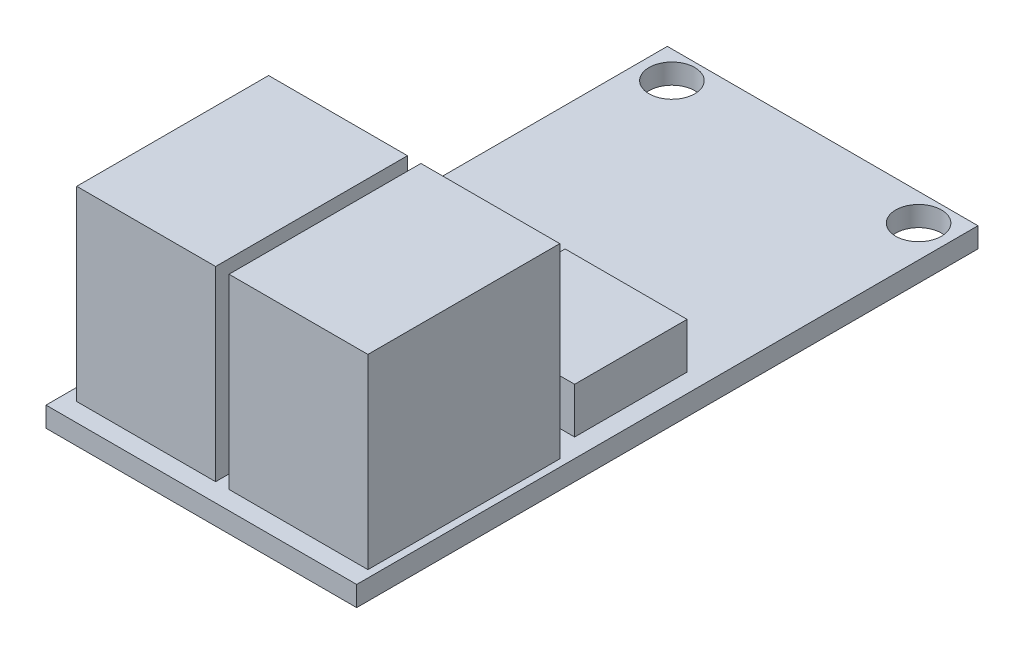
ISO-10303-21;
HEADER;
FILE_DESCRIPTION(('STEP AP214'),'2;1');
FILE_NAME('part.step','',(''),(''),'','','');
FILE_SCHEMA(('AUTOMOTIVE_DESIGN { 1 0 10303 214 1 1 1 1 }'));
ENDSEC;
DATA;
#1=APPLICATION_CONTEXT('core data for automotive mechanical design processes');
#2=APPLICATION_PROTOCOL_DEFINITION('international standard','automotive_design',2000,#1);
#3=PRODUCT_CONTEXT('',#1,'mechanical');
#4=PRODUCT('Part','Part','',(#3));
#5=PRODUCT_RELATED_PRODUCT_CATEGORY('part','',(#4));
#6=PRODUCT_DEFINITION_FORMATION('','',#4);
#7=PRODUCT_DEFINITION_CONTEXT('part definition',#1,'design');
#8=PRODUCT_DEFINITION('design','',#6,#7);
#9=PRODUCT_DEFINITION_SHAPE('','',#8);
#10=(LENGTH_UNIT() NAMED_UNIT(*) SI_UNIT(.MILLI.,.METRE.));
#11=(NAMED_UNIT(*) PLANE_ANGLE_UNIT() SI_UNIT($,.RADIAN.));
#12=(NAMED_UNIT(*) SI_UNIT($,.STERADIAN.) SOLID_ANGLE_UNIT());
#13=UNCERTAINTY_MEASURE_WITH_UNIT(LENGTH_MEASURE(1.E-05),#10,'distance_accuracy_value','');
#14=(GEOMETRIC_REPRESENTATION_CONTEXT(3) GLOBAL_UNCERTAINTY_ASSIGNED_CONTEXT((#13)) GLOBAL_UNIT_ASSIGNED_CONTEXT((#10,
#11,#12)) REPRESENTATION_CONTEXT('',''));
#15=CARTESIAN_POINT('',(0.,0.,0.));
#16=DIRECTION('',(0.,0.,1.));
#17=DIRECTION('',(1.,0.,0.));
#18=AXIS2_PLACEMENT_3D('',#15,#16,#17);
#19=CARTESIAN_POINT('',(9.30380204289463,3.6,-19.1029979436487));
#20=DIRECTION('',(1.,0.,0.));
#21=DIRECTION('',(0.,0.,-1.));
#22=AXIS2_PLACEMENT_3D('',#19,#20,#21);
#23=PLANE('',#22);
#24=DIRECTION('',(0.,0.,1.));
#25=VECTOR('',#24,1.);
#26=CARTESIAN_POINT('',(9.30380204289463,1.1,-19.1029979436487));
#27=LINE('',#26,#25);
#28=CARTESIAN_POINT('',(9.30380204289463,1.1,-19.1029979436487));
#29=VERTEX_POINT('',#28);
#30=CARTESIAN_POINT('',(9.30380204289463,1.1,-12.9497817381579));
#31=VERTEX_POINT('',#30);
#32=EDGE_CURVE('E12',#29,#31,#27,.T.);
#33=ORIENTED_EDGE('',*,*,#32,.T.);
#34=DIRECTION('',(0.,-1.,0.));
#35=VECTOR('',#34,1.);
#36=CARTESIAN_POINT('',(9.30380204289463,3.6,-12.9497817381579));
#37=LINE('',#36,#35);
#38=CARTESIAN_POINT('',(9.30380204289463,3.6,-12.9497817381579));
#39=VERTEX_POINT('',#38);
#40=EDGE_CURVE('E127',#39,#31,#37,.T.);
#41=ORIENTED_EDGE('',*,*,#40,.F.);
#42=DIRECTION('',(0.,0.,1.));
#43=VECTOR('',#42,1.);
#44=CARTESIAN_POINT('',(9.30380204289463,3.6,-19.1029979436487));
#45=LINE('',#44,#43);
#46=CARTESIAN_POINT('',(9.30380204289463,3.6,-19.1029979436487));
#47=VERTEX_POINT('',#46);
#48=EDGE_CURVE('E60',#47,#39,#45,.T.);
#49=ORIENTED_EDGE('',*,*,#48,.F.);
#50=DIRECTION('',(0.,-1.,0.));
#51=VECTOR('',#50,1.);
#52=CARTESIAN_POINT('',(9.30380204289463,3.6,-19.1029979436487));
#53=LINE('',#52,#51);
#54=EDGE_CURVE('E115',#47,#29,#53,.T.);
#55=ORIENTED_EDGE('',*,*,#54,.T.);
#56=EDGE_LOOP('',(#33,#41,#49,#55));
#57=FACE_BOUND('',#56,.T.);
#58=ADVANCED_FACE('F56',(#57),#23,.F.);
#59=CARTESIAN_POINT('',(9.30380204289463,3.6,-12.9497817381579));
#60=DIRECTION('',(0.,0.,-1.));
#61=DIRECTION('',(-1.,0.,0.));
#62=AXIS2_PLACEMENT_3D('',#59,#60,#61);
#63=PLANE('',#62);
#64=DIRECTION('',(1.,0.,0.));
#65=VECTOR('',#64,1.);
#66=CARTESIAN_POINT('',(9.30380204289463,1.1,-12.9497817381579));
#67=LINE('',#66,#65);
#68=CARTESIAN_POINT('',(15.9773260218623,1.1,-12.9497817381579));
#69=VERTEX_POINT('',#68);
#70=EDGE_CURVE('E66',#31,#69,#67,.T.);
#71=ORIENTED_EDGE('',*,*,#70,.T.);
#72=DIRECTION('',(0.,-1.,0.));
#73=VECTOR('',#72,1.);
#74=CARTESIAN_POINT('',(15.9773260218623,3.6,-12.9497817381579));
#75=LINE('',#74,#73);
#76=CARTESIAN_POINT('',(15.9773260218623,3.6,-12.9497817381579));
#77=VERTEX_POINT('',#76);
#78=EDGE_CURVE('E111',#77,#69,#75,.T.);
#79=ORIENTED_EDGE('',*,*,#78,.F.);
#80=DIRECTION('',(1.,0.,0.));
#81=VECTOR('',#80,1.);
#82=CARTESIAN_POINT('',(9.30380204289463,3.6,-12.9497817381579));
#83=LINE('',#82,#81);
#84=EDGE_CURVE('E90',#39,#77,#83,.T.);
#85=ORIENTED_EDGE('',*,*,#84,.F.);
#86=ORIENTED_EDGE('',*,*,#40,.T.);
#87=EDGE_LOOP('',(#71,#79,#85,#86));
#88=FACE_BOUND('',#87,.T.);
#89=ADVANCED_FACE('F130',(#88),#63,.F.);
#90=CARTESIAN_POINT('',(15.9773260218623,3.6,-19.1029979436487));
#91=DIRECTION('',(-1.,0.,0.));
#92=DIRECTION('',(0.,0.,1.));
#93=AXIS2_PLACEMENT_3D('',#90,#91,#92);
#94=PLANE('',#93);
#95=DIRECTION('',(0.,0.,-1.));
#96=VECTOR('',#95,1.);
#97=CARTESIAN_POINT('',(15.9773260218623,1.1,-19.1029979436487));
#98=LINE('',#97,#96);
#99=CARTESIAN_POINT('',(15.9773260218623,1.1,-19.1029979436487));
#100=VERTEX_POINT('',#99);
#101=EDGE_CURVE('E106',#69,#100,#98,.T.);
#102=ORIENTED_EDGE('',*,*,#101,.T.);
#103=DIRECTION('',(0.,-1.,0.));
#104=VECTOR('',#103,1.);
#105=CARTESIAN_POINT('',(15.9773260218623,3.6,-19.1029979436487));
#106=LINE('',#105,#104);
#107=CARTESIAN_POINT('',(15.9773260218623,3.6,-19.1029979436487));
#108=VERTEX_POINT('',#107);
#109=EDGE_CURVE('E109',#108,#100,#106,.T.);
#110=ORIENTED_EDGE('',*,*,#109,.F.);
#111=DIRECTION('',(0.,0.,-1.));
#112=VECTOR('',#111,1.);
#113=CARTESIAN_POINT('',(15.9773260218623,3.6,-19.1029979436487));
#114=LINE('',#113,#112);
#115=EDGE_CURVE('E123',#77,#108,#114,.T.);
#116=ORIENTED_EDGE('',*,*,#115,.F.);
#117=ORIENTED_EDGE('',*,*,#78,.T.);
#118=EDGE_LOOP('',(#102,#110,#116,#117));
#119=FACE_BOUND('',#118,.T.);
#120=ADVANCED_FACE('F107',(#119),#94,.F.);
#121=CARTESIAN_POINT('',(9.30380204289463,3.6,-19.1029979436487));
#122=DIRECTION('',(0.,0.,1.));
#123=DIRECTION('',(1.,0.,0.));
#124=AXIS2_PLACEMENT_3D('',#121,#122,#123);
#125=PLANE('',#124);
#126=DIRECTION('',(-1.,0.,0.));
#127=VECTOR('',#126,1.);
#128=CARTESIAN_POINT('',(9.30380204289463,1.1,-19.1029979436487));
#129=LINE('',#128,#127);
#130=EDGE_CURVE('E100',#100,#29,#129,.T.);
#131=ORIENTED_EDGE('',*,*,#130,.T.);
#132=ORIENTED_EDGE('',*,*,#54,.F.);
#133=DIRECTION('',(-1.,0.,0.));
#134=VECTOR('',#133,1.);
#135=CARTESIAN_POINT('',(9.30380204289463,3.6,-19.1029979436487));
#136=LINE('',#135,#134);
#137=EDGE_CURVE('E114',#108,#47,#136,.T.);
#138=ORIENTED_EDGE('',*,*,#137,.F.);
#139=ORIENTED_EDGE('',*,*,#109,.T.);
#140=EDGE_LOOP('',(#131,#132,#138,#139));
#141=FACE_BOUND('',#140,.T.);
#142=ADVANCED_FACE('F113',(#141),#125,.F.);
#143=CARTESIAN_POINT('',(0.,3.6,0.));
#144=DIRECTION('',(0.,1.,0.));
#145=DIRECTION('',(0.,0.,1.));
#146=AXIS2_PLACEMENT_3D('',#143,#144,#145);
#147=PLANE('',#146);
#148=ORIENTED_EDGE('',*,*,#48,.T.);
#149=ORIENTED_EDGE('',*,*,#84,.T.);
#150=ORIENTED_EDGE('',*,*,#115,.T.);
#151=ORIENTED_EDGE('',*,*,#137,.T.);
#152=EDGE_LOOP('',(#148,#149,#150,#151));
#153=FACE_BOUND('',#152,.T.);
#154=ADVANCED_FACE('F58',(#153),#147,.T.);
#155=CARTESIAN_POINT('',(0.,1.1,0.));
#156=DIRECTION('',(0.,1.,0.));
#157=DIRECTION('',(0.,0.,1.));
#158=AXIS2_PLACEMENT_3D('',#155,#156,#157);
#159=PLANE('',#158);
#160=ORIENTED_EDGE('',*,*,#32,.F.);
#161=ORIENTED_EDGE('',*,*,#130,.F.);
#162=ORIENTED_EDGE('',*,*,#101,.F.);
#163=ORIENTED_EDGE('',*,*,#70,.F.);
#164=EDGE_LOOP('',(#160,#161,#162,#163));
#165=FACE_BOUND('',#164,.T.);
#166=ADVANCED_FACE('F117',(#165),#159,.F.);
#167=CLOSED_SHELL('',(#58,#89,#120,#142,#154,#166));
#168=MANIFOLD_SOLID_BREP('B2',#167);
#169=CARTESIAN_POINT('',(1.33422922904867,3.6,-19.1029979436487));
#170=DIRECTION('',(1.,0.,0.));
#171=DIRECTION('',(0.,0.,-1.));
#172=AXIS2_PLACEMENT_3D('',#169,#170,#171);
#173=PLANE('',#172);
#174=DIRECTION('',(0.,0.,1.));
#175=VECTOR('',#174,1.);
#176=CARTESIAN_POINT('',(1.33422922904867,1.1,-19.1029979436487));
#177=LINE('',#176,#175);
#178=CARTESIAN_POINT('',(1.33422922904867,1.1,-19.1029979436487));
#179=VERTEX_POINT('',#178);
#180=CARTESIAN_POINT('',(1.33422922904867,1.1,-12.9497817381579));
#181=VERTEX_POINT('',#180);
#182=EDGE_CURVE('E277',#179,#181,#177,.T.);
#183=ORIENTED_EDGE('',*,*,#182,.T.);
#184=DIRECTION('',(0.,-1.,0.));
#185=VECTOR('',#184,1.);
#186=CARTESIAN_POINT('',(1.33422922904867,3.6,-12.9497817381579));
#187=LINE('',#186,#185);
#188=CARTESIAN_POINT('',(1.33422922904867,3.6,-12.9497817381579));
#189=VERTEX_POINT('',#188);
#190=EDGE_CURVE('E54',#189,#181,#187,.T.);
#191=ORIENTED_EDGE('',*,*,#190,.F.);
#192=DIRECTION('',(0.,0.,1.));
#193=VECTOR('',#192,1.);
#194=CARTESIAN_POINT('',(1.33422922904867,3.6,-19.1029979436487));
#195=LINE('',#194,#193);
#196=CARTESIAN_POINT('',(1.33422922904867,3.6,-19.1029979436487));
#197=VERTEX_POINT('',#196);
#198=EDGE_CURVE('E265',#197,#189,#195,.T.);
#199=ORIENTED_EDGE('',*,*,#198,.F.);
#200=DIRECTION('',(0.,-1.,0.));
#201=VECTOR('',#200,1.);
#202=CARTESIAN_POINT('',(1.33422922904867,3.6,-19.1029979436487));
#203=LINE('',#202,#201);
#204=EDGE_CURVE('E273',#197,#179,#203,.T.);
#205=ORIENTED_EDGE('',*,*,#204,.T.);
#206=EDGE_LOOP('',(#183,#191,#199,#205));
#207=FACE_BOUND('',#206,.T.);
#208=ADVANCED_FACE('F214',(#207),#173,.F.);
#209=CARTESIAN_POINT('',(1.33422922904867,3.6,-12.9497817381579));
#210=DIRECTION('',(0.,0.,-1.));
#211=DIRECTION('',(-1.,0.,0.));
#212=AXIS2_PLACEMENT_3D('',#209,#210,#211);
#213=PLANE('',#212);
#214=DIRECTION('',(1.,0.,0.));
#215=VECTOR('',#214,1.);
#216=CARTESIAN_POINT('',(1.33422922904867,1.1,-12.9497817381579));
#217=LINE('',#216,#215);
#218=CARTESIAN_POINT('',(7.72111187272268,1.1,-12.9497817381579));
#219=VERTEX_POINT('',#218);
#220=EDGE_CURVE('E269',#181,#219,#217,.T.);
#221=ORIENTED_EDGE('',*,*,#220,.T.);
#222=DIRECTION('',(0.,-1.,0.));
#223=VECTOR('',#222,1.);
#224=CARTESIAN_POINT('',(7.72111187272268,3.6,-12.9497817381579));
#225=LINE('',#224,#223);
#226=CARTESIAN_POINT('',(7.72111187272268,3.6,-12.9497817381579));
#227=VERTEX_POINT('',#226);
#228=EDGE_CURVE('E222',#227,#219,#225,.T.);
#229=ORIENTED_EDGE('',*,*,#228,.F.);
#230=DIRECTION('',(1.,0.,0.));
#231=VECTOR('',#230,1.);
#232=CARTESIAN_POINT('',(1.33422922904867,3.6,-12.9497817381579));
#233=LINE('',#232,#231);
#234=EDGE_CURVE('E260',#189,#227,#233,.T.);
#235=ORIENTED_EDGE('',*,*,#234,.F.);
#236=ORIENTED_EDGE('',*,*,#190,.T.);
#237=EDGE_LOOP('',(#221,#229,#235,#236));
#238=FACE_BOUND('',#237,.T.);
#239=ADVANCED_FACE('F268',(#238),#213,.F.);
#240=CARTESIAN_POINT('',(7.72111187272268,3.6,-19.1029979436487));
#241=DIRECTION('',(-1.,0.,0.));
#242=DIRECTION('',(0.,0.,1.));
#243=AXIS2_PLACEMENT_3D('',#240,#241,#242);
#244=PLANE('',#243);
#245=DIRECTION('',(0.,0.,-1.));
#246=VECTOR('',#245,1.);
#247=CARTESIAN_POINT('',(7.72111187272268,1.1,-19.1029979436487));
#248=LINE('',#247,#246);
#249=CARTESIAN_POINT('',(7.72111187272268,1.1,-19.1029979436487));
#250=VERTEX_POINT('',#249);
#251=EDGE_CURVE('E247',#219,#250,#248,.T.);
#252=ORIENTED_EDGE('',*,*,#251,.T.);
#253=DIRECTION('',(0.,-1.,0.));
#254=VECTOR('',#253,1.);
#255=CARTESIAN_POINT('',(7.72111187272268,3.6,-19.1029979436487));
#256=LINE('',#255,#254);
#257=CARTESIAN_POINT('',(7.72111187272268,3.6,-19.1029979436487));
#258=VERTEX_POINT('',#257);
#259=EDGE_CURVE('E270',#258,#250,#256,.T.);
#260=ORIENTED_EDGE('',*,*,#259,.F.);
#261=DIRECTION('',(0.,0.,-1.));
#262=VECTOR('',#261,1.);
#263=CARTESIAN_POINT('',(7.72111187272268,3.6,-19.1029979436487));
#264=LINE('',#263,#262);
#265=EDGE_CURVE('E263',#227,#258,#264,.T.);
#266=ORIENTED_EDGE('',*,*,#265,.F.);
#267=ORIENTED_EDGE('',*,*,#228,.T.);
#268=EDGE_LOOP('',(#252,#260,#266,#267));
#269=FACE_BOUND('',#268,.T.);
#270=ADVANCED_FACE('F271',(#269),#244,.F.);
#271=CARTESIAN_POINT('',(1.33422922904867,3.6,-19.1029979436487));
#272=DIRECTION('',(0.,0.,1.));
#273=DIRECTION('',(1.,0.,0.));
#274=AXIS2_PLACEMENT_3D('',#271,#272,#273);
#275=PLANE('',#274);
#276=DIRECTION('',(-1.,0.,0.));
#277=VECTOR('',#276,1.);
#278=CARTESIAN_POINT('',(1.33422922904867,1.1,-19.1029979436487));
#279=LINE('',#278,#277);
#280=EDGE_CURVE('E253',#250,#179,#279,.T.);
#281=ORIENTED_EDGE('',*,*,#280,.T.);
#282=ORIENTED_EDGE('',*,*,#204,.F.);
#283=DIRECTION('',(-1.,0.,0.));
#284=VECTOR('',#283,1.);
#285=CARTESIAN_POINT('',(1.33422922904867,3.6,-19.1029979436487));
#286=LINE('',#285,#284);
#287=EDGE_CURVE('E230',#258,#197,#286,.T.);
#288=ORIENTED_EDGE('',*,*,#287,.F.);
#289=ORIENTED_EDGE('',*,*,#259,.T.);
#290=EDGE_LOOP('',(#281,#282,#288,#289));
#291=FACE_BOUND('',#290,.T.);
#292=ADVANCED_FACE('F284',(#291),#275,.F.);
#293=CARTESIAN_POINT('',(0.,3.6,0.));
#294=DIRECTION('',(0.,1.,0.));
#295=DIRECTION('',(0.,0.,1.));
#296=AXIS2_PLACEMENT_3D('',#293,#294,#295);
#297=PLANE('',#296);
#298=ORIENTED_EDGE('',*,*,#198,.T.);
#299=ORIENTED_EDGE('',*,*,#234,.T.);
#300=ORIENTED_EDGE('',*,*,#265,.T.);
#301=ORIENTED_EDGE('',*,*,#287,.T.);
#302=EDGE_LOOP('',(#298,#299,#300,#301));
#303=FACE_BOUND('',#302,.T.);
#304=ADVANCED_FACE('F261',(#303),#297,.T.);
#305=CARTESIAN_POINT('',(0.,1.1,0.));
#306=DIRECTION('',(0.,1.,0.));
#307=DIRECTION('',(0.,0.,1.));
#308=AXIS2_PLACEMENT_3D('',#305,#306,#307);
#309=PLANE('',#308);
#310=ORIENTED_EDGE('',*,*,#182,.F.);
#311=ORIENTED_EDGE('',*,*,#280,.F.);
#312=ORIENTED_EDGE('',*,*,#251,.F.);
#313=ORIENTED_EDGE('',*,*,#220,.F.);
#314=EDGE_LOOP('',(#310,#311,#312,#313));
#315=FACE_BOUND('',#314,.T.);
#316=ADVANCED_FACE('F287',(#315),#309,.F.);
#317=CLOSED_SHELL('',(#208,#239,#270,#292,#304,#316));
#318=MANIFOLD_SOLID_BREP('B6',#317);
#319=CARTESIAN_POINT('',(9.00627728273026,11.3,-11.5088387026949));
#320=DIRECTION('',(1.,0.,0.));
#321=DIRECTION('',(0.,0.,-1.));
#322=AXIS2_PLACEMENT_3D('',#319,#320,#321);
#323=PLANE('',#322);
#324=DIRECTION('',(0.,0.,1.));
#325=VECTOR('',#324,1.);
#326=CARTESIAN_POINT('',(9.00627728273026,1.1,-11.5088387026949));
#327=LINE('',#326,#325);
#328=CARTESIAN_POINT('',(9.00627728273026,1.1,-11.5088387026949));
#329=VERTEX_POINT('',#328);
#330=CARTESIAN_POINT('',(9.00627728273026,1.1,-1.00883870269491));
#331=VERTEX_POINT('',#330);
#332=EDGE_CURVE('E212',#329,#331,#327,.T.);
#333=ORIENTED_EDGE('',*,*,#332,.T.);
#334=DIRECTION('',(0.,-1.,0.));
#335=VECTOR('',#334,1.);
#336=CARTESIAN_POINT('',(9.00627728273026,11.3,-1.00883870269491));
#337=LINE('',#336,#335);
#338=CARTESIAN_POINT('',(9.00627728273026,11.3,-1.00883870269491));
#339=VERTEX_POINT('',#338);
#340=EDGE_CURVE('E443',#339,#331,#337,.T.);
#341=ORIENTED_EDGE('',*,*,#340,.F.);
#342=DIRECTION('',(0.,0.,1.));
#343=VECTOR('',#342,1.);
#344=CARTESIAN_POINT('',(9.00627728273026,11.3,-11.5088387026949));
#345=LINE('',#344,#343);
#346=CARTESIAN_POINT('',(9.00627728273026,11.3,-11.5088387026949));
#347=VERTEX_POINT('',#346);
#348=EDGE_CURVE('E376',#347,#339,#345,.T.);
#349=ORIENTED_EDGE('',*,*,#348,.F.);
#350=DIRECTION('',(0.,-1.,0.));
#351=VECTOR('',#350,1.);
#352=CARTESIAN_POINT('',(9.00627728273026,11.3,-11.5088387026949));
#353=LINE('',#352,#351);
#354=EDGE_CURVE('E431',#347,#329,#353,.T.);
#355=ORIENTED_EDGE('',*,*,#354,.T.);
#356=EDGE_LOOP('',(#333,#341,#349,#355));
#357=FACE_BOUND('',#356,.T.);
#358=ADVANCED_FACE('F372',(#357),#323,.F.);
#359=CARTESIAN_POINT('',(9.00627728273026,11.3,-1.00883870269491));
#360=DIRECTION('',(0.,0.,-1.));
#361=DIRECTION('',(-1.,0.,0.));
#362=AXIS2_PLACEMENT_3D('',#359,#360,#361);
#363=PLANE('',#362);
#364=DIRECTION('',(1.,0.,0.));
#365=VECTOR('',#364,1.);
#366=CARTESIAN_POINT('',(9.00627728273026,1.1,-1.00883870269491));
#367=LINE('',#366,#365);
#368=CARTESIAN_POINT('',(16.6062772827303,1.1,-1.00883870269491));
#369=VERTEX_POINT('',#368);
#370=EDGE_CURVE('E382',#331,#369,#367,.T.);
#371=ORIENTED_EDGE('',*,*,#370,.T.);
#372=DIRECTION('',(0.,-1.,0.));
#373=VECTOR('',#372,1.);
#374=CARTESIAN_POINT('',(16.6062772827303,11.3,-1.00883870269491));
#375=LINE('',#374,#373);
#376=CARTESIAN_POINT('',(16.6062772827303,11.3,-1.00883870269491));
#377=VERTEX_POINT('',#376);
#378=EDGE_CURVE('E427',#377,#369,#375,.T.);
#379=ORIENTED_EDGE('',*,*,#378,.F.);
#380=DIRECTION('',(1.,0.,0.));
#381=VECTOR('',#380,1.);
#382=CARTESIAN_POINT('',(9.00627728273026,11.3,-1.00883870269491));
#383=LINE('',#382,#381);
#384=EDGE_CURVE('E406',#339,#377,#383,.T.);
#385=ORIENTED_EDGE('',*,*,#384,.F.);
#386=ORIENTED_EDGE('',*,*,#340,.T.);
#387=EDGE_LOOP('',(#371,#379,#385,#386));
#388=FACE_BOUND('',#387,.T.);
#389=ADVANCED_FACE('F446',(#388),#363,.F.);
#390=CARTESIAN_POINT('',(16.6062772827303,11.3,-11.5088387026949));
#391=DIRECTION('',(-1.,0.,0.));
#392=DIRECTION('',(0.,0.,1.));
#393=AXIS2_PLACEMENT_3D('',#390,#391,#392);
#394=PLANE('',#393);
#395=DIRECTION('',(0.,0.,-1.));
#396=VECTOR('',#395,1.);
#397=CARTESIAN_POINT('',(16.6062772827303,1.1,-11.5088387026949));
#398=LINE('',#397,#396);
#399=CARTESIAN_POINT('',(16.6062772827303,1.1,-11.5088387026949));
#400=VERTEX_POINT('',#399);
#401=EDGE_CURVE('E422',#369,#400,#398,.T.);
#402=ORIENTED_EDGE('',*,*,#401,.T.);
#403=DIRECTION('',(0.,-1.,0.));
#404=VECTOR('',#403,1.);
#405=CARTESIAN_POINT('',(16.6062772827303,11.3,-11.5088387026949));
#406=LINE('',#405,#404);
#407=CARTESIAN_POINT('',(16.6062772827303,11.3,-11.5088387026949));
#408=VERTEX_POINT('',#407);
#409=EDGE_CURVE('E425',#408,#400,#406,.T.);
#410=ORIENTED_EDGE('',*,*,#409,.F.);
#411=DIRECTION('',(0.,0.,-1.));
#412=VECTOR('',#411,1.);
#413=CARTESIAN_POINT('',(16.6062772827303,11.3,-11.5088387026949));
#414=LINE('',#413,#412);
#415=EDGE_CURVE('E439',#377,#408,#414,.T.);
#416=ORIENTED_EDGE('',*,*,#415,.F.);
#417=ORIENTED_EDGE('',*,*,#378,.T.);
#418=EDGE_LOOP('',(#402,#410,#416,#417));
#419=FACE_BOUND('',#418,.T.);
#420=ADVANCED_FACE('F423',(#419),#394,.F.);
#421=CARTESIAN_POINT('',(9.00627728273026,11.3,-11.5088387026949));
#422=DIRECTION('',(0.,0.,1.));
#423=DIRECTION('',(1.,0.,0.));
#424=AXIS2_PLACEMENT_3D('',#421,#422,#423);
#425=PLANE('',#424);
#426=DIRECTION('',(-1.,0.,0.));
#427=VECTOR('',#426,1.);
#428=CARTESIAN_POINT('',(9.00627728273026,1.1,-11.5088387026949));
#429=LINE('',#428,#427);
#430=EDGE_CURVE('E416',#400,#329,#429,.T.);
#431=ORIENTED_EDGE('',*,*,#430,.T.);
#432=ORIENTED_EDGE('',*,*,#354,.F.);
#433=DIRECTION('',(-1.,0.,0.));
#434=VECTOR('',#433,1.);
#435=CARTESIAN_POINT('',(9.00627728273026,11.3,-11.5088387026949));
#436=LINE('',#435,#434);
#437=EDGE_CURVE('E430',#408,#347,#436,.T.);
#438=ORIENTED_EDGE('',*,*,#437,.F.);
#439=ORIENTED_EDGE('',*,*,#409,.T.);
#440=EDGE_LOOP('',(#431,#432,#438,#439));
#441=FACE_BOUND('',#440,.T.);
#442=ADVANCED_FACE('F429',(#441),#425,.F.);
#443=CARTESIAN_POINT('',(0.,11.3,0.));
#444=DIRECTION('',(0.,1.,0.));
#445=DIRECTION('',(0.,0.,1.));
#446=AXIS2_PLACEMENT_3D('',#443,#444,#445);
#447=PLANE('',#446);
#448=ORIENTED_EDGE('',*,*,#348,.T.);
#449=ORIENTED_EDGE('',*,*,#384,.T.);
#450=ORIENTED_EDGE('',*,*,#415,.T.);
#451=ORIENTED_EDGE('',*,*,#437,.T.);
#452=EDGE_LOOP('',(#448,#449,#450,#451));
#453=FACE_BOUND('',#452,.T.);
#454=ADVANCED_FACE('F374',(#453),#447,.T.);
#455=CARTESIAN_POINT('',(0.,1.1,0.));
#456=DIRECTION('',(0.,1.,0.));
#457=DIRECTION('',(0.,0.,1.));
#458=AXIS2_PLACEMENT_3D('',#455,#456,#457);
#459=PLANE('',#458);
#460=ORIENTED_EDGE('',*,*,#332,.F.);
#461=ORIENTED_EDGE('',*,*,#430,.F.);
#462=ORIENTED_EDGE('',*,*,#401,.F.);
#463=ORIENTED_EDGE('',*,*,#370,.F.);
#464=EDGE_LOOP('',(#460,#461,#462,#463));
#465=FACE_BOUND('',#464,.T.);
#466=ADVANCED_FACE('F433',(#465),#459,.F.);
#467=CLOSED_SHELL('',(#358,#389,#420,#442,#454,#466));
#468=MANIFOLD_SOLID_BREP('B48',#467);
#469=CARTESIAN_POINT('',(0.672174320862945,11.3,-1.00883870269491));
#470=DIRECTION('',(1.,0.,0.));
#471=DIRECTION('',(0.,0.,-1.));
#472=AXIS2_PLACEMENT_3D('',#469,#470,#471);
#473=PLANE('',#472);
#474=DIRECTION('',(0.,0.,1.));
#475=VECTOR('',#474,1.);
#476=CARTESIAN_POINT('',(0.672174320862945,1.1,-1.00883870269491));
#477=LINE('',#476,#475);
#478=CARTESIAN_POINT('',(0.672174320862945,1.1,-11.5088387026949));
#479=VERTEX_POINT('',#478);
#480=CARTESIAN_POINT('',(0.672174320862945,1.1,-1.00883870269491));
#481=VERTEX_POINT('',#480);
#482=EDGE_CURVE('E568',#479,#481,#477,.T.);
#483=ORIENTED_EDGE('',*,*,#482,.T.);
#484=DIRECTION('',(0.,-1.,0.));
#485=VECTOR('',#484,1.);
#486=CARTESIAN_POINT('',(0.672174320862945,11.3,-1.00883870269491));
#487=LINE('',#486,#485);
#488=CARTESIAN_POINT('',(0.672174320862945,11.3,-1.00883870269491));
#489=VERTEX_POINT('',#488);
#490=EDGE_CURVE('E370',#489,#481,#487,.T.);
#491=ORIENTED_EDGE('',*,*,#490,.F.);
#492=DIRECTION('',(0.,0.,1.));
#493=VECTOR('',#492,1.);
#494=CARTESIAN_POINT('',(0.672174320862945,11.3,-1.00883870269491));
#495=LINE('',#494,#493);
#496=CARTESIAN_POINT('',(0.672174320862945,11.3,-11.5088387026949));
#497=VERTEX_POINT('',#496);
#498=EDGE_CURVE('E556',#497,#489,#495,.T.);
#499=ORIENTED_EDGE('',*,*,#498,.F.);
#500=DIRECTION('',(0.,-1.,0.));
#501=VECTOR('',#500,1.);
#502=CARTESIAN_POINT('',(0.672174320862945,11.3,-11.5088387026949));
#503=LINE('',#502,#501);
#504=EDGE_CURVE('E564',#497,#479,#503,.T.);
#505=ORIENTED_EDGE('',*,*,#504,.T.);
#506=EDGE_LOOP('',(#483,#491,#499,#505));
#507=FACE_BOUND('',#506,.T.);
#508=ADVANCED_FACE('F505',(#507),#473,.F.);
#509=CARTESIAN_POINT('',(0.672174320862945,11.3,-1.00883870269491));
#510=DIRECTION('',(0.,0.,-1.));
#511=DIRECTION('',(-1.,0.,0.));
#512=AXIS2_PLACEMENT_3D('',#509,#510,#511);
#513=PLANE('',#512);
#514=DIRECTION('',(1.,0.,0.));
#515=VECTOR('',#514,1.);
#516=CARTESIAN_POINT('',(0.672174320862945,1.1,-1.00883870269491));
#517=LINE('',#516,#515);
#518=CARTESIAN_POINT('',(8.27217432086294,1.1,-1.00883870269491));
#519=VERTEX_POINT('',#518);
#520=EDGE_CURVE('E560',#481,#519,#517,.T.);
#521=ORIENTED_EDGE('',*,*,#520,.T.);
#522=DIRECTION('',(0.,-1.,0.));
#523=VECTOR('',#522,1.);
#524=CARTESIAN_POINT('',(8.27217432086294,11.3,-1.00883870269491));
#525=LINE('',#524,#523);
#526=CARTESIAN_POINT('',(8.27217432086294,11.3,-1.00883870269491));
#527=VERTEX_POINT('',#526);
#528=EDGE_CURVE('E513',#527,#519,#525,.T.);
#529=ORIENTED_EDGE('',*,*,#528,.F.);
#530=DIRECTION('',(1.,0.,0.));
#531=VECTOR('',#530,1.);
#532=CARTESIAN_POINT('',(0.672174320862945,11.3,-1.00883870269491));
#533=LINE('',#532,#531);
#534=EDGE_CURVE('E551',#489,#527,#533,.T.);
#535=ORIENTED_EDGE('',*,*,#534,.F.);
#536=ORIENTED_EDGE('',*,*,#490,.T.);
#537=EDGE_LOOP('',(#521,#529,#535,#536));
#538=FACE_BOUND('',#537,.T.);
#539=ADVANCED_FACE('F559',(#538),#513,.F.);
#540=CARTESIAN_POINT('',(8.27217432086294,11.3,-1.00883870269491));
#541=DIRECTION('',(-1.,0.,0.));
#542=DIRECTION('',(0.,0.,1.));
#543=AXIS2_PLACEMENT_3D('',#540,#541,#542);
#544=PLANE('',#543);
#545=DIRECTION('',(0.,0.,-1.));
#546=VECTOR('',#545,1.);
#547=CARTESIAN_POINT('',(8.27217432086294,1.1,-1.00883870269491));
#548=LINE('',#547,#546);
#549=CARTESIAN_POINT('',(8.27217432086294,1.1,-11.5088387026949));
#550=VERTEX_POINT('',#549);
#551=EDGE_CURVE('E538',#519,#550,#548,.T.);
#552=ORIENTED_EDGE('',*,*,#551,.T.);
#553=DIRECTION('',(0.,-1.,0.));
#554=VECTOR('',#553,1.);
#555=CARTESIAN_POINT('',(8.27217432086294,11.3,-11.5088387026949));
#556=LINE('',#555,#554);
#557=CARTESIAN_POINT('',(8.27217432086294,11.3,-11.5088387026949));
#558=VERTEX_POINT('',#557);
#559=EDGE_CURVE('E561',#558,#550,#556,.T.);
#560=ORIENTED_EDGE('',*,*,#559,.F.);
#561=DIRECTION('',(0.,0.,-1.));
#562=VECTOR('',#561,1.);
#563=CARTESIAN_POINT('',(8.27217432086294,11.3,-1.00883870269491));
#564=LINE('',#563,#562);
#565=EDGE_CURVE('E554',#527,#558,#564,.T.);
#566=ORIENTED_EDGE('',*,*,#565,.F.);
#567=ORIENTED_EDGE('',*,*,#528,.T.);
#568=EDGE_LOOP('',(#552,#560,#566,#567));
#569=FACE_BOUND('',#568,.T.);
#570=ADVANCED_FACE('F562',(#569),#544,.F.);
#571=CARTESIAN_POINT('',(0.672174320862945,11.3,-11.5088387026949));
#572=DIRECTION('',(0.,0.,1.));
#573=DIRECTION('',(1.,0.,0.));
#574=AXIS2_PLACEMENT_3D('',#571,#572,#573);
#575=PLANE('',#574);
#576=DIRECTION('',(-1.,0.,0.));
#577=VECTOR('',#576,1.);
#578=CARTESIAN_POINT('',(0.672174320862945,1.1,-11.5088387026949));
#579=LINE('',#578,#577);
#580=EDGE_CURVE('E544',#550,#479,#579,.T.);
#581=ORIENTED_EDGE('',*,*,#580,.T.);
#582=ORIENTED_EDGE('',*,*,#504,.F.);
#583=DIRECTION('',(-1.,0.,0.));
#584=VECTOR('',#583,1.);
#585=CARTESIAN_POINT('',(0.672174320862945,11.3,-11.5088387026949));
#586=LINE('',#585,#584);
#587=EDGE_CURVE('E521',#558,#497,#586,.T.);
#588=ORIENTED_EDGE('',*,*,#587,.F.);
#589=ORIENTED_EDGE('',*,*,#559,.T.);
#590=EDGE_LOOP('',(#581,#582,#588,#589));
#591=FACE_BOUND('',#590,.T.);
#592=ADVANCED_FACE('F575',(#591),#575,.F.);
#593=CARTESIAN_POINT('',(0.,11.3,0.));
#594=DIRECTION('',(0.,-1.,0.));
#595=DIRECTION('',(0.,0.,-1.));
#596=AXIS2_PLACEMENT_3D('',#593,#594,#595);
#597=PLANE('',#596);
#598=ORIENTED_EDGE('',*,*,#498,.T.);
#599=ORIENTED_EDGE('',*,*,#534,.T.);
#600=ORIENTED_EDGE('',*,*,#565,.T.);
#601=ORIENTED_EDGE('',*,*,#587,.T.);
#602=EDGE_LOOP('',(#598,#599,#600,#601));
#603=FACE_BOUND('',#602,.T.);
#604=ADVANCED_FACE('F552',(#603),#597,.F.);
#605=CARTESIAN_POINT('',(0.,1.1,0.));
#606=DIRECTION('',(0.,-1.,0.));
#607=DIRECTION('',(0.,0.,-1.));
#608=AXIS2_PLACEMENT_3D('',#605,#606,#607);
#609=PLANE('',#608);
#610=ORIENTED_EDGE('',*,*,#482,.F.);
#611=ORIENTED_EDGE('',*,*,#580,.F.);
#612=ORIENTED_EDGE('',*,*,#551,.F.);
#613=ORIENTED_EDGE('',*,*,#520,.F.);
#614=EDGE_LOOP('',(#610,#611,#612,#613));
#615=FACE_BOUND('',#614,.T.);
#616=ADVANCED_FACE('F578',(#615),#609,.T.);
#617=CLOSED_SHELL('',(#508,#539,#570,#592,#604,#616));
#618=MANIFOLD_SOLID_BREP('B206',#617);
#619=CARTESIAN_POINT('',(0.,1.1,0.));
#620=DIRECTION('',(0.,0.,-1.));
#621=DIRECTION('',(-1.,0.,0.));
#622=AXIS2_PLACEMENT_3D('',#619,#620,#621);
#623=PLANE('',#622);
#624=DIRECTION('',(1.,0.,0.));
#625=VECTOR('',#624,1.);
#626=CARTESIAN_POINT('',(0.,0.,0.));
#627=LINE('',#626,#625);
#628=CARTESIAN_POINT('',(0.,0.,0.));
#629=VERTEX_POINT('',#628);
#630=CARTESIAN_POINT('',(17.,0.,0.));
#631=VERTEX_POINT('',#630);
#632=EDGE_CURVE('E699',#629,#631,#627,.T.);
#633=ORIENTED_EDGE('',*,*,#632,.T.);
#634=DIRECTION('',(0.,-1.,0.));
#635=VECTOR('',#634,1.);
#636=CARTESIAN_POINT('',(17.,1.1,0.));
#637=LINE('',#636,#635);
#638=CARTESIAN_POINT('',(17.,1.1,0.));
#639=VERTEX_POINT('',#638);
#640=EDGE_CURVE('E503',#639,#631,#637,.T.);
#641=ORIENTED_EDGE('',*,*,#640,.F.);
#642=DIRECTION('',(1.,0.,0.));
#643=VECTOR('',#642,1.);
#644=CARTESIAN_POINT('',(0.,1.1,0.));
#645=LINE('',#644,#643);
#646=CARTESIAN_POINT('',(0.,1.1,0.));
#647=VERTEX_POINT('',#646);
#648=EDGE_CURVE('E679',#647,#639,#645,.T.);
#649=ORIENTED_EDGE('',*,*,#648,.F.);
#650=DIRECTION('',(0.,-1.,0.));
#651=VECTOR('',#650,1.);
#652=CARTESIAN_POINT('',(0.,1.1,0.));
#653=LINE('',#652,#651);
#654=EDGE_CURVE('E645',#647,#629,#653,.T.);
#655=ORIENTED_EDGE('',*,*,#654,.T.);
#656=EDGE_LOOP('',(#633,#641,#649,#655));
#657=FACE_BOUND('',#656,.T.);
#658=ADVANCED_FACE('F629',(#657),#623,.F.);
#659=CARTESIAN_POINT('',(17.,1.1,0.));
#660=DIRECTION('',(-1.,0.,0.));
#661=DIRECTION('',(0.,0.,1.));
#662=AXIS2_PLACEMENT_3D('',#659,#660,#661);
#663=PLANE('',#662);
#664=DIRECTION('',(0.,0.,-1.));
#665=VECTOR('',#664,1.);
#666=CARTESIAN_POINT('',(17.,0.,0.));
#667=LINE('',#666,#665);
#668=CARTESIAN_POINT('',(17.,0.,-34.));
#669=VERTEX_POINT('',#668);
#670=EDGE_CURVE('E684',#631,#669,#667,.T.);
#671=ORIENTED_EDGE('',*,*,#670,.T.);
#672=DIRECTION('',(0.,-1.,0.));
#673=VECTOR('',#672,1.);
#674=CARTESIAN_POINT('',(17.,1.1,-34.));
#675=LINE('',#674,#673);
#676=CARTESIAN_POINT('',(17.,1.1,-34.));
#677=VERTEX_POINT('',#676);
#678=EDGE_CURVE('E637',#677,#669,#675,.T.);
#679=ORIENTED_EDGE('',*,*,#678,.F.);
#680=DIRECTION('',(0.,0.,-1.));
#681=VECTOR('',#680,1.);
#682=CARTESIAN_POINT('',(17.,1.1,0.));
#683=LINE('',#682,#681);
#684=EDGE_CURVE('E670',#639,#677,#683,.T.);
#685=ORIENTED_EDGE('',*,*,#684,.F.);
#686=ORIENTED_EDGE('',*,*,#640,.T.);
#687=EDGE_LOOP('',(#671,#679,#685,#686));
#688=FACE_BOUND('',#687,.T.);
#689=ADVANCED_FACE('F683',(#688),#663,.F.);
#690=CARTESIAN_POINT('',(0.,1.1,-34.));
#691=DIRECTION('',(0.,0.,-1.));
#692=DIRECTION('',(-1.,0.,0.));
#693=AXIS2_PLACEMENT_3D('',#690,#691,#692);
#694=PLANE('',#693);
#695=DIRECTION('',(1.,0.,0.));
#696=VECTOR('',#695,1.);
#697=CARTESIAN_POINT('',(0.,0.,-34.));
#698=LINE('',#697,#696);
#699=CARTESIAN_POINT('',(0.,0.,-34.));
#700=VERTEX_POINT('',#699);
#701=EDGE_CURVE('E702',#700,#669,#698,.T.);
#702=ORIENTED_EDGE('',*,*,#701,.F.);
#703=DIRECTION('',(0.,-1.,0.));
#704=VECTOR('',#703,1.);
#705=CARTESIAN_POINT('',(0.,1.1,-34.));
#706=LINE('',#705,#704);
#707=CARTESIAN_POINT('',(0.,1.1,-34.));
#708=VERTEX_POINT('',#707);
#709=EDGE_CURVE('E659',#708,#700,#706,.T.);
#710=ORIENTED_EDGE('',*,*,#709,.F.);
#711=DIRECTION('',(1.,0.,0.));
#712=VECTOR('',#711,1.);
#713=CARTESIAN_POINT('',(0.,1.1,-34.));
#714=LINE('',#713,#712);
#715=EDGE_CURVE('E678',#708,#677,#714,.T.);
#716=ORIENTED_EDGE('',*,*,#715,.T.);
#717=ORIENTED_EDGE('',*,*,#678,.T.);
#718=EDGE_LOOP('',(#702,#710,#716,#717));
#719=FACE_BOUND('',#718,.T.);
#720=ADVANCED_FACE('F687',(#719),#694,.T.);
#721=CARTESIAN_POINT('',(1.75,1.1,-32.5));
#722=DIRECTION('',(0.,-1.,0.));
#723=DIRECTION('',(0.,0.,-1.));
#724=AXIS2_PLACEMENT_3D('',#721,#722,#723);
#725=CYLINDRICAL_SURFACE('',#724,1.25);
#726=CARTESIAN_POINT('',(1.75,1.1,-32.5));
#727=DIRECTION('',(0.,1.,0.));
#728=DIRECTION('',(0.,0.,1.));
#729=AXIS2_PLACEMENT_3D('',#726,#727,#728);
#730=CIRCLE('',#729,1.25);
#731=CARTESIAN_POINT('',(1.75,1.1,-31.25));
#732=VERTEX_POINT('',#731);
#733=EDGE_CURVE('E690',#732,#732,#730,.T.);
#734=ORIENTED_EDGE('',*,*,#733,.T.);
#735=EDGE_LOOP('',(#734));
#736=FACE_BOUND('',#735,.T.);
#737=CARTESIAN_POINT('',(1.75,0.,-32.5));
#738=DIRECTION('',(0.,1.,0.));
#739=DIRECTION('',(0.,0.,1.));
#740=AXIS2_PLACEMENT_3D('',#737,#738,#739);
#741=CIRCLE('',#740,1.25);
#742=CARTESIAN_POINT('',(1.75,0.,-31.25));
#743=VERTEX_POINT('',#742);
#744=EDGE_CURVE('E707',#743,#743,#741,.T.);
#745=ORIENTED_EDGE('',*,*,#744,.F.);
#746=EDGE_LOOP('',(#745));
#747=FACE_BOUND('',#746,.T.);
#748=ADVANCED_FACE('F728',(#736,#747),#725,.F.);
#749=CARTESIAN_POINT('',(0.,1.1,0.));
#750=DIRECTION('',(-1.,0.,0.));
#751=DIRECTION('',(0.,0.,1.));
#752=AXIS2_PLACEMENT_3D('',#749,#750,#751);
#753=PLANE('',#752);
#754=DIRECTION('',(0.,0.,-1.));
#755=VECTOR('',#754,1.);
#756=CARTESIAN_POINT('',(0.,0.,0.));
#757=LINE('',#756,#755);
#758=EDGE_CURVE('E704',#629,#700,#757,.T.);
#759=ORIENTED_EDGE('',*,*,#758,.F.);
#760=ORIENTED_EDGE('',*,*,#654,.F.);
#761=DIRECTION('',(0.,0.,-1.));
#762=VECTOR('',#761,1.);
#763=CARTESIAN_POINT('',(0.,1.1,0.));
#764=LINE('',#763,#762);
#765=EDGE_CURVE('E688',#647,#708,#764,.T.);
#766=ORIENTED_EDGE('',*,*,#765,.T.);
#767=ORIENTED_EDGE('',*,*,#709,.T.);
#768=EDGE_LOOP('',(#759,#760,#766,#767));
#769=FACE_BOUND('',#768,.T.);
#770=ADVANCED_FACE('F720',(#769),#753,.T.);
#771=CARTESIAN_POINT('',(15.25,1.1,-32.5));
#772=DIRECTION('',(0.,-1.,0.));
#773=DIRECTION('',(0.,0.,-1.));
#774=AXIS2_PLACEMENT_3D('',#771,#772,#773);
#775=CYLINDRICAL_SURFACE('',#774,1.25);
#776=CARTESIAN_POINT('',(15.25,1.1,-32.5));
#777=DIRECTION('',(0.,1.,0.));
#778=DIRECTION('',(0.,0.,1.));
#779=AXIS2_PLACEMENT_3D('',#776,#777,#778);
#780=CIRCLE('',#779,1.25);
#781=CARTESIAN_POINT('',(15.25,1.1,-31.25));
#782=VERTEX_POINT('',#781);
#783=EDGE_CURVE('E696',#782,#782,#780,.T.);
#784=ORIENTED_EDGE('',*,*,#783,.T.);
#785=EDGE_LOOP('',(#784));
#786=FACE_BOUND('',#785,.T.);
#787=CARTESIAN_POINT('',(15.25,0.,-32.5));
#788=DIRECTION('',(0.,1.,0.));
#789=DIRECTION('',(0.,0.,1.));
#790=AXIS2_PLACEMENT_3D('',#787,#788,#789);
#791=CIRCLE('',#790,1.25);
#792=CARTESIAN_POINT('',(15.25,0.,-31.25));
#793=VERTEX_POINT('',#792);
#794=EDGE_CURVE('E710',#793,#793,#791,.T.);
#795=ORIENTED_EDGE('',*,*,#794,.F.);
#796=EDGE_LOOP('',(#795));
#797=FACE_BOUND('',#796,.T.);
#798=ADVANCED_FACE('F718',(#786,#797),#775,.F.);
#799=CARTESIAN_POINT('',(0.,1.1,0.));
#800=DIRECTION('',(0.,1.,0.));
#801=DIRECTION('',(0.,0.,1.));
#802=AXIS2_PLACEMENT_3D('',#799,#800,#801);
#803=PLANE('',#802);
#804=ORIENTED_EDGE('',*,*,#648,.T.);
#805=ORIENTED_EDGE('',*,*,#684,.T.);
#806=ORIENTED_EDGE('',*,*,#715,.F.);
#807=ORIENTED_EDGE('',*,*,#765,.F.);
#808=EDGE_LOOP('',(#804,#805,#806,#807));
#809=FACE_BOUND('',#808,.T.);
#810=ORIENTED_EDGE('',*,*,#733,.F.);
#811=EDGE_LOOP('',(#810));
#812=FACE_BOUND('',#811,.T.);
#813=ORIENTED_EDGE('',*,*,#783,.F.);
#814=EDGE_LOOP('',(#813));
#815=FACE_BOUND('',#814,.T.);
#816=ADVANCED_FACE('F674',(#809,#812,#815),#803,.T.);
#817=CARTESIAN_POINT('',(0.,0.,0.));
#818=DIRECTION('',(0.,1.,0.));
#819=DIRECTION('',(0.,0.,1.));
#820=AXIS2_PLACEMENT_3D('',#817,#818,#819);
#821=PLANE('',#820);
#822=ORIENTED_EDGE('',*,*,#632,.F.);
#823=ORIENTED_EDGE('',*,*,#758,.T.);
#824=ORIENTED_EDGE('',*,*,#701,.T.);
#825=ORIENTED_EDGE('',*,*,#670,.F.);
#826=EDGE_LOOP('',(#822,#823,#824,#825));
#827=FACE_BOUND('',#826,.T.);
#828=ORIENTED_EDGE('',*,*,#744,.T.);
#829=EDGE_LOOP('',(#828));
#830=FACE_BOUND('',#829,.T.);
#831=ORIENTED_EDGE('',*,*,#794,.T.);
#832=EDGE_LOOP('',(#831));
#833=FACE_BOUND('',#832,.T.);
#834=ADVANCED_FACE('F716',(#827,#830,#833),#821,.F.);
#835=CLOSED_SHELL('',(#658,#689,#720,#748,#770,#798,#816,#834));
#836=MANIFOLD_SOLID_BREP('B364',#835);
#837=ADVANCED_BREP_SHAPE_REPRESENTATION('',(#18,#168,#318,#468,#618,#836),#14);
#838=SHAPE_DEFINITION_REPRESENTATION(#9,#837);
ENDSEC;
END-ISO-10303-21;
